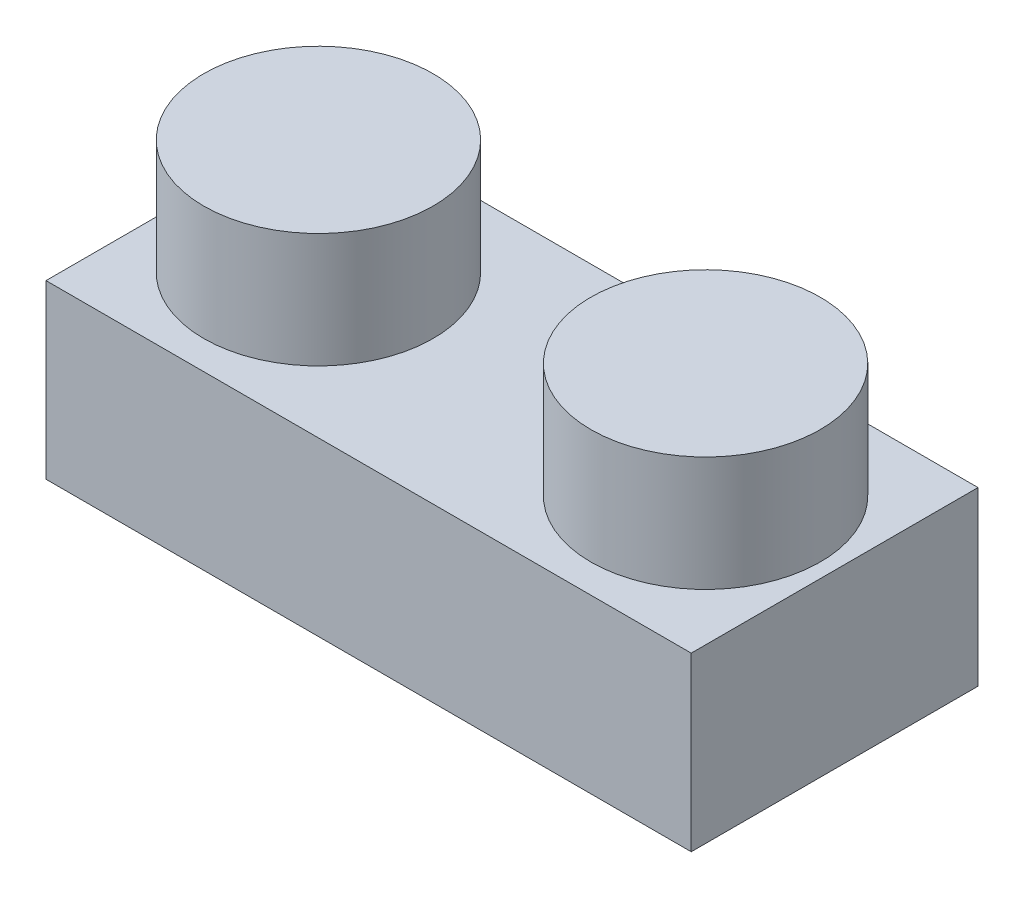
ISO-10303-21;
HEADER;
FILE_DESCRIPTION(('STEP AP214'),'2;1');
FILE_NAME('part.step','',(''),(''),'','','');
FILE_SCHEMA(('AUTOMOTIVE_DESIGN { 1 0 10303 214 1 1 1 1 }'));
ENDSEC;
DATA;
#1=APPLICATION_CONTEXT('core data for automotive mechanical design processes');
#2=APPLICATION_PROTOCOL_DEFINITION('international standard','automotive_design',2000,#1);
#3=PRODUCT_CONTEXT('',#1,'mechanical');
#4=PRODUCT('Part','Part','',(#3));
#5=PRODUCT_RELATED_PRODUCT_CATEGORY('part','',(#4));
#6=PRODUCT_DEFINITION_FORMATION('','',#4);
#7=PRODUCT_DEFINITION_CONTEXT('part definition',#1,'design');
#8=PRODUCT_DEFINITION('design','',#6,#7);
#9=PRODUCT_DEFINITION_SHAPE('','',#8);
#10=(LENGTH_UNIT() NAMED_UNIT(*) SI_UNIT(.MILLI.,.METRE.));
#11=(NAMED_UNIT(*) PLANE_ANGLE_UNIT() SI_UNIT($,.RADIAN.));
#12=(NAMED_UNIT(*) SI_UNIT($,.STERADIAN.) SOLID_ANGLE_UNIT());
#13=UNCERTAINTY_MEASURE_WITH_UNIT(LENGTH_MEASURE(1.E-05),#10,'distance_accuracy_value','');
#14=(GEOMETRIC_REPRESENTATION_CONTEXT(3) GLOBAL_UNCERTAINTY_ASSIGNED_CONTEXT((#13)) GLOBAL_UNIT_ASSIGNED_CONTEXT((#10,
#11,#12)) REPRESENTATION_CONTEXT('',''));
#15=CARTESIAN_POINT('',(0.,0.,0.));
#16=DIRECTION('',(0.,0.,1.));
#17=DIRECTION('',(1.,0.,0.));
#18=AXIS2_PLACEMENT_3D('',#15,#16,#17);
#19=CARTESIAN_POINT('',(0.,12.,0.));
#20=DIRECTION('',(0.,1.,0.));
#21=DIRECTION('',(0.,0.,1.));
#22=AXIS2_PLACEMENT_3D('',#19,#20,#21);
#23=PLANE('',#22);
#24=CARTESIAN_POINT('',(-13.5,12.,0.));
#25=DIRECTION('',(0.,1.,0.));
#26=DIRECTION('',(0.,0.,1.));
#27=AXIS2_PLACEMENT_3D('',#24,#25,#26);
#28=CIRCLE('',#27,8.);
#29=CARTESIAN_POINT('',(-13.5,12.,8.));
#30=VERTEX_POINT('',#29);
#31=EDGE_CURVE('E111',#30,#30,#28,.T.);
#32=ORIENTED_EDGE('',*,*,#31,.F.);
#33=EDGE_LOOP('',(#32));
#34=FACE_BOUND('',#33,.T.);
#35=DIRECTION('',(0.,0.,-1.));
#36=VECTOR('',#35,1.);
#37=CARTESIAN_POINT('',(22.5,12.,-10.));
#38=LINE('',#37,#36);
#39=CARTESIAN_POINT('',(22.5,12.,10.));
#40=VERTEX_POINT('',#39);
#41=CARTESIAN_POINT('',(22.5,12.,-10.));
#42=VERTEX_POINT('',#41);
#43=EDGE_CURVE('E85',#40,#42,#38,.T.);
#44=ORIENTED_EDGE('',*,*,#43,.T.);
#45=DIRECTION('',(-1.,0.,0.));
#46=VECTOR('',#45,1.);
#47=CARTESIAN_POINT('',(-22.5,12.,-10.));
#48=LINE('',#47,#46);
#49=CARTESIAN_POINT('',(-22.5,12.,-10.));
#50=VERTEX_POINT('',#49);
#51=EDGE_CURVE('E80',#42,#50,#48,.T.);
#52=ORIENTED_EDGE('',*,*,#51,.T.);
#53=DIRECTION('',(0.,0.,1.));
#54=VECTOR('',#53,1.);
#55=CARTESIAN_POINT('',(-22.5,12.,-10.));
#56=LINE('',#55,#54);
#57=CARTESIAN_POINT('',(-22.5,12.,10.));
#58=VERTEX_POINT('',#57);
#59=EDGE_CURVE('E83',#50,#58,#56,.T.);
#60=ORIENTED_EDGE('',*,*,#59,.T.);
#61=DIRECTION('',(1.,0.,0.));
#62=VECTOR('',#61,1.);
#63=CARTESIAN_POINT('',(-22.5,12.,10.));
#64=LINE('',#63,#62);
#65=EDGE_CURVE('E50',#58,#40,#64,.T.);
#66=ORIENTED_EDGE('',*,*,#65,.T.);
#67=EDGE_LOOP('',(#44,#52,#60,#66));
#68=FACE_BOUND('',#67,.T.);
#69=CARTESIAN_POINT('',(13.5,12.,0.));
#70=DIRECTION('',(0.,1.,0.));
#71=DIRECTION('',(0.,0.,1.));
#72=AXIS2_PLACEMENT_3D('',#69,#70,#71);
#73=CIRCLE('',#72,8.);
#74=CARTESIAN_POINT('',(13.5,12.,8.));
#75=VERTEX_POINT('',#74);
#76=EDGE_CURVE('E117',#75,#75,#73,.T.);
#77=ORIENTED_EDGE('',*,*,#76,.F.);
#78=EDGE_LOOP('',(#77));
#79=FACE_BOUND('',#78,.T.);
#80=ADVANCED_FACE('F33',(#34,#68,#79),#23,.T.);
#81=CARTESIAN_POINT('',(22.5,12.,-10.));
#82=DIRECTION('',(-1.,0.,0.));
#83=DIRECTION('',(0.,0.,1.));
#84=AXIS2_PLACEMENT_3D('',#81,#82,#83);
#85=PLANE('',#84);
#86=DIRECTION('',(0.,0.,-1.));
#87=VECTOR('',#86,1.);
#88=CARTESIAN_POINT('',(22.5,0.,-10.));
#89=LINE('',#88,#87);
#90=CARTESIAN_POINT('',(22.5,0.,10.));
#91=VERTEX_POINT('',#90);
#92=CARTESIAN_POINT('',(22.5,0.,-10.));
#93=VERTEX_POINT('',#92);
#94=EDGE_CURVE('E97',#91,#93,#89,.T.);
#95=ORIENTED_EDGE('',*,*,#94,.T.);
#96=DIRECTION('',(0.,-1.,0.));
#97=VECTOR('',#96,1.);
#98=CARTESIAN_POINT('',(22.5,12.,-10.));
#99=LINE('',#98,#97);
#100=EDGE_CURVE('E11',#42,#93,#99,.T.);
#101=ORIENTED_EDGE('',*,*,#100,.F.);
#102=ORIENTED_EDGE('',*,*,#43,.F.);
#103=DIRECTION('',(0.,-1.,0.));
#104=VECTOR('',#103,1.);
#105=CARTESIAN_POINT('',(22.5,12.,10.));
#106=LINE('',#105,#104);
#107=EDGE_CURVE('E93',#40,#91,#106,.T.);
#108=ORIENTED_EDGE('',*,*,#107,.T.);
#109=EDGE_LOOP('',(#95,#101,#102,#108));
#110=FACE_BOUND('',#109,.T.);
#111=ADVANCED_FACE('F35',(#110),#85,.F.);
#112=CARTESIAN_POINT('',(-22.5,12.,-10.));
#113=DIRECTION('',(0.,0.,1.));
#114=DIRECTION('',(1.,0.,0.));
#115=AXIS2_PLACEMENT_3D('',#112,#113,#114);
#116=PLANE('',#115);
#117=DIRECTION('',(-1.,0.,0.));
#118=VECTOR('',#117,1.);
#119=CARTESIAN_POINT('',(-22.5,0.,-10.));
#120=LINE('',#119,#118);
#121=CARTESIAN_POINT('',(-22.5,0.,-10.));
#122=VERTEX_POINT('',#121);
#123=EDGE_CURVE('E89',#93,#122,#120,.T.);
#124=ORIENTED_EDGE('',*,*,#123,.T.);
#125=DIRECTION('',(0.,-1.,0.));
#126=VECTOR('',#125,1.);
#127=CARTESIAN_POINT('',(-22.5,12.,-10.));
#128=LINE('',#127,#126);
#129=EDGE_CURVE('E42',#50,#122,#128,.T.);
#130=ORIENTED_EDGE('',*,*,#129,.F.);
#131=ORIENTED_EDGE('',*,*,#51,.F.);
#132=ORIENTED_EDGE('',*,*,#100,.T.);
#133=EDGE_LOOP('',(#124,#130,#131,#132));
#134=FACE_BOUND('',#133,.T.);
#135=ADVANCED_FACE('F88',(#134),#116,.F.);
#136=CARTESIAN_POINT('',(-22.5,12.,-10.));
#137=DIRECTION('',(1.,0.,0.));
#138=DIRECTION('',(0.,0.,-1.));
#139=AXIS2_PLACEMENT_3D('',#136,#137,#138);
#140=PLANE('',#139);
#141=DIRECTION('',(0.,0.,1.));
#142=VECTOR('',#141,1.);
#143=CARTESIAN_POINT('',(-22.5,0.,-10.));
#144=LINE('',#143,#142);
#145=CARTESIAN_POINT('',(-22.5,0.,10.));
#146=VERTEX_POINT('',#145);
#147=EDGE_CURVE('E67',#122,#146,#144,.T.);
#148=ORIENTED_EDGE('',*,*,#147,.T.);
#149=DIRECTION('',(0.,-1.,0.));
#150=VECTOR('',#149,1.);
#151=CARTESIAN_POINT('',(-22.5,12.,10.));
#152=LINE('',#151,#150);
#153=EDGE_CURVE('E90',#58,#146,#152,.T.);
#154=ORIENTED_EDGE('',*,*,#153,.F.);
#155=ORIENTED_EDGE('',*,*,#59,.F.);
#156=ORIENTED_EDGE('',*,*,#129,.T.);
#157=EDGE_LOOP('',(#148,#154,#155,#156));
#158=FACE_BOUND('',#157,.T.);
#159=ADVANCED_FACE('F91',(#158),#140,.F.);
#160=CARTESIAN_POINT('',(-22.5,12.,10.));
#161=DIRECTION('',(0.,0.,-1.));
#162=DIRECTION('',(-1.,0.,0.));
#163=AXIS2_PLACEMENT_3D('',#160,#161,#162);
#164=PLANE('',#163);
#165=DIRECTION('',(1.,0.,0.));
#166=VECTOR('',#165,1.);
#167=CARTESIAN_POINT('',(-22.5,0.,10.));
#168=LINE('',#167,#166);
#169=EDGE_CURVE('E73',#146,#91,#168,.T.);
#170=ORIENTED_EDGE('',*,*,#169,.T.);
#171=ORIENTED_EDGE('',*,*,#107,.F.);
#172=ORIENTED_EDGE('',*,*,#65,.F.);
#173=ORIENTED_EDGE('',*,*,#153,.T.);
#174=EDGE_LOOP('',(#170,#171,#172,#173));
#175=FACE_BOUND('',#174,.T.);
#176=ADVANCED_FACE('F105',(#175),#164,.F.);
#177=CARTESIAN_POINT('',(0.,0.,0.));
#178=DIRECTION('',(0.,1.,0.));
#179=DIRECTION('',(0.,0.,1.));
#180=AXIS2_PLACEMENT_3D('',#177,#178,#179);
#181=PLANE('',#180);
#182=ORIENTED_EDGE('',*,*,#94,.F.);
#183=ORIENTED_EDGE('',*,*,#169,.F.);
#184=ORIENTED_EDGE('',*,*,#147,.F.);
#185=ORIENTED_EDGE('',*,*,#123,.F.);
#186=EDGE_LOOP('',(#182,#183,#184,#185));
#187=FACE_BOUND('',#186,.T.);
#188=ADVANCED_FACE('F108',(#187),#181,.F.);
#189=CARTESIAN_POINT('',(-13.5,20.,0.));
#190=DIRECTION('',(0.,-1.,0.));
#191=DIRECTION('',(0.,0.,-1.));
#192=AXIS2_PLACEMENT_3D('',#189,#190,#191);
#193=CYLINDRICAL_SURFACE('',#192,8.);
#194=CARTESIAN_POINT('',(-13.5,20.,0.));
#195=DIRECTION('',(0.,1.,0.));
#196=DIRECTION('',(0.,0.,1.));
#197=AXIS2_PLACEMENT_3D('',#194,#195,#196);
#198=CIRCLE('',#197,8.);
#199=CARTESIAN_POINT('',(-13.5,20.,8.));
#200=VERTEX_POINT('',#199);
#201=EDGE_CURVE('E100',#200,#200,#198,.T.);
#202=ORIENTED_EDGE('',*,*,#201,.F.);
#203=EDGE_LOOP('',(#202));
#204=FACE_BOUND('',#203,.T.);
#205=ORIENTED_EDGE('',*,*,#31,.T.);
#206=EDGE_LOOP('',(#205));
#207=FACE_BOUND('',#206,.T.);
#208=ADVANCED_FACE('F140',(#204,#207),#193,.T.);
#209=CARTESIAN_POINT('',(-13.5,20.,0.));
#210=DIRECTION('',(0.,1.,0.));
#211=DIRECTION('',(0.,0.,1.));
#212=AXIS2_PLACEMENT_3D('',#209,#210,#211);
#213=PLANE('',#212);
#214=ORIENTED_EDGE('',*,*,#201,.T.);
#215=EDGE_LOOP('',(#214));
#216=FACE_BOUND('',#215,.T.);
#217=ADVANCED_FACE('F128',(#216),#213,.T.);
#218=CARTESIAN_POINT('',(13.5,20.,0.));
#219=DIRECTION('',(0.,-1.,0.));
#220=DIRECTION('',(0.,0.,-1.));
#221=AXIS2_PLACEMENT_3D('',#218,#219,#220);
#222=CYLINDRICAL_SURFACE('',#221,8.);
#223=CARTESIAN_POINT('',(13.5,20.,0.));
#224=DIRECTION('',(0.,1.,0.));
#225=DIRECTION('',(0.,0.,1.));
#226=AXIS2_PLACEMENT_3D('',#223,#224,#225);
#227=CIRCLE('',#226,8.);
#228=CARTESIAN_POINT('',(13.5,20.,8.));
#229=VERTEX_POINT('',#228);
#230=EDGE_CURVE('E114',#229,#229,#227,.T.);
#231=ORIENTED_EDGE('',*,*,#230,.F.);
#232=EDGE_LOOP('',(#231));
#233=FACE_BOUND('',#232,.T.);
#234=ORIENTED_EDGE('',*,*,#76,.T.);
#235=EDGE_LOOP('',(#234));
#236=FACE_BOUND('',#235,.T.);
#237=ADVANCED_FACE('F125',(#233,#236),#222,.T.);
#238=CARTESIAN_POINT('',(13.5,20.,0.));
#239=DIRECTION('',(0.,1.,0.));
#240=DIRECTION('',(0.,0.,1.));
#241=AXIS2_PLACEMENT_3D('',#238,#239,#240);
#242=PLANE('',#241);
#243=ORIENTED_EDGE('',*,*,#230,.T.);
#244=EDGE_LOOP('',(#243));
#245=FACE_BOUND('',#244,.T.);
#246=ADVANCED_FACE('F123',(#245),#242,.T.);
#247=CLOSED_SHELL('',(#80,#111,#135,#159,#176,#188,#208,#217,#237,#246));
#248=MANIFOLD_SOLID_BREP('B2',#247);
#249=ADVANCED_BREP_SHAPE_REPRESENTATION('',(#18,#248),#14);
#250=SHAPE_DEFINITION_REPRESENTATION(#9,#249);
ENDSEC;
END-ISO-10303-21;
